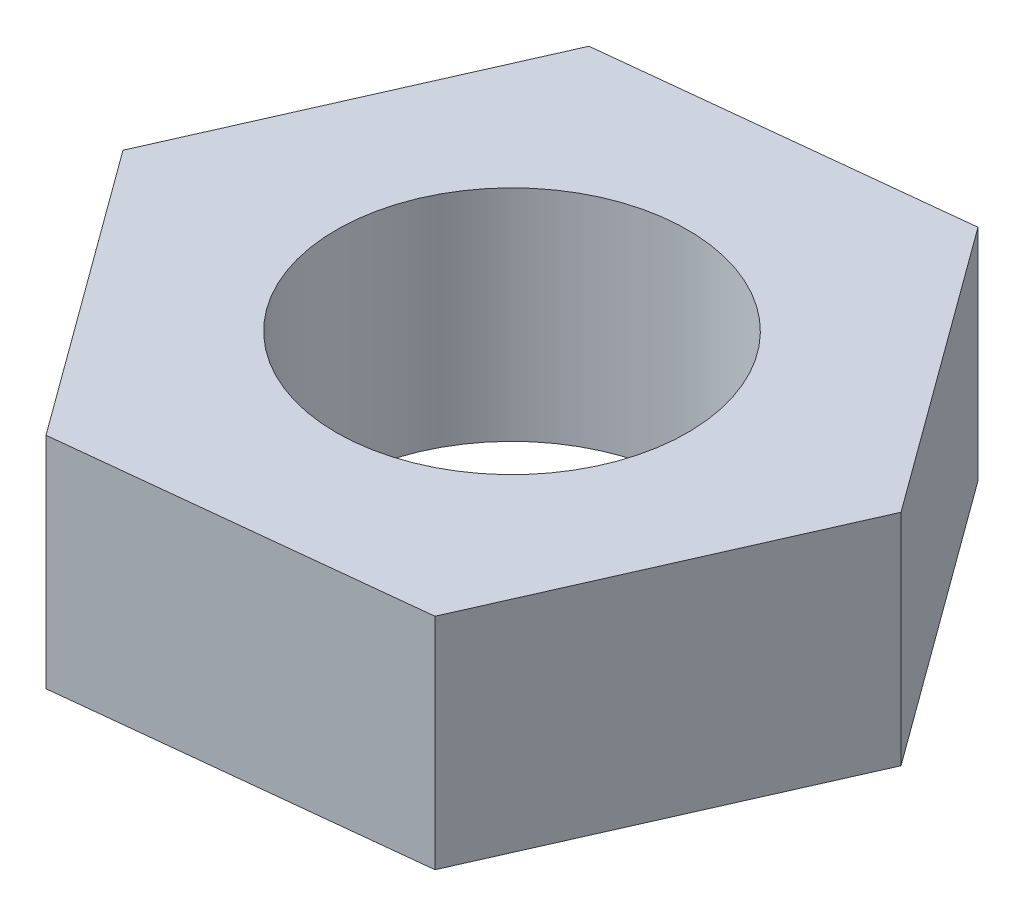
ISO-10303-21;
HEADER;
FILE_DESCRIPTION(('STEP AP214'),'2;1');
FILE_NAME('part.step','',(''),(''),'','','');
FILE_SCHEMA(('AUTOMOTIVE_DESIGN { 1 0 10303 214 1 1 1 1 }'));
ENDSEC;
DATA;
#1=APPLICATION_CONTEXT('core data for automotive mechanical design processes');
#2=APPLICATION_PROTOCOL_DEFINITION('international standard','automotive_design',2000,#1);
#3=PRODUCT_CONTEXT('',#1,'mechanical');
#4=PRODUCT('Part','Part','',(#3));
#5=PRODUCT_RELATED_PRODUCT_CATEGORY('part','',(#4));
#6=PRODUCT_DEFINITION_FORMATION('','',#4);
#7=PRODUCT_DEFINITION_CONTEXT('part definition',#1,'design');
#8=PRODUCT_DEFINITION('design','',#6,#7);
#9=PRODUCT_DEFINITION_SHAPE('','',#8);
#10=(LENGTH_UNIT() NAMED_UNIT(*) SI_UNIT(.MILLI.,.METRE.));
#11=(NAMED_UNIT(*) PLANE_ANGLE_UNIT() SI_UNIT($,.RADIAN.));
#12=(NAMED_UNIT(*) SI_UNIT($,.STERADIAN.) SOLID_ANGLE_UNIT());
#13=UNCERTAINTY_MEASURE_WITH_UNIT(LENGTH_MEASURE(1.E-05),#10,'distance_accuracy_value','');
#14=(GEOMETRIC_REPRESENTATION_CONTEXT(3) GLOBAL_UNCERTAINTY_ASSIGNED_CONTEXT((#13)) GLOBAL_UNIT_ASSIGNED_CONTEXT((#10,
#11,#12)) REPRESENTATION_CONTEXT('',''));
#15=CARTESIAN_POINT('',(0.,0.,0.));
#16=DIRECTION('',(0.,0.,1.));
#17=DIRECTION('',(1.,0.,0.));
#18=AXIS2_PLACEMENT_3D('',#15,#16,#17);
#19=CARTESIAN_POINT('',(0.,5.,0.));
#20=DIRECTION('',(0.,1.,0.));
#21=DIRECTION('',(0.,0.,1.));
#22=AXIS2_PLACEMENT_3D('',#19,#20,#21);
#23=PLANE('',#22);
#24=DIRECTION('',(0.99427058744468,0.,-0.106892464385528));
#25=VECTOR('',#24,1.);
#26=CARTESIAN_POINT('',(-3.25487879021415,5.,7.35760174160312));
#27=LINE('',#26,#25);
#28=CARTESIAN_POINT('',(-3.25487879021415,5.,7.35760174160312));
#29=VERTEX_POINT('',#28);
#30=CARTESIAN_POINT('',(4.74443062404986,5.,6.49760858936617));
#31=VERTEX_POINT('',#30);
#32=EDGE_CURVE('E150',#29,#31,#27,.T.);
#33=ORIENTED_EDGE('',*,*,#32,.T.);
#34=DIRECTION('',(0.404563704091349,0.,-0.914509819155534));
#35=VECTOR('',#34,1.);
#36=CARTESIAN_POINT('',(4.74443062404986,5.,6.49760858936617));
#37=LINE('',#36,#35);
#38=CARTESIAN_POINT('',(7.999309414264,5.,-0.859993152236947));
#39=VERTEX_POINT('',#38);
#40=EDGE_CURVE('E98',#31,#39,#37,.T.);
#41=ORIENTED_EDGE('',*,*,#40,.T.);
#42=DIRECTION('',(-0.58970688335333,0.,-0.807617354770006));
#43=VECTOR('',#42,1.);
#44=CARTESIAN_POINT('',(7.999309414264,5.,-0.859993152236947));
#45=LINE('',#44,#43);
#46=CARTESIAN_POINT('',(3.25487879021415,5.,-7.35760174160312));
#47=VERTEX_POINT('',#46);
#48=EDGE_CURVE('E111',#39,#47,#45,.T.);
#49=ORIENTED_EDGE('',*,*,#48,.T.);
#50=DIRECTION('',(-0.99427058744468,0.,0.106892464385527));
#51=VECTOR('',#50,1.);
#52=CARTESIAN_POINT('',(3.25487879021415,5.,-7.35760174160312));
#53=LINE('',#52,#51);
#54=CARTESIAN_POINT('',(-4.74443062404986,5.,-6.49760858936618));
#55=VERTEX_POINT('',#54);
#56=EDGE_CURVE('E105',#47,#55,#53,.T.);
#57=ORIENTED_EDGE('',*,*,#56,.T.);
#58=DIRECTION('',(-0.404563704091349,0.,0.914509819155534));
#59=VECTOR('',#58,1.);
#60=CARTESIAN_POINT('',(-4.74443062404986,5.,-6.49760858936618));
#61=LINE('',#60,#59);
#62=CARTESIAN_POINT('',(-7.999309414264,5.,0.859993152236946));
#63=VERTEX_POINT('',#62);
#64=EDGE_CURVE('E109',#55,#63,#61,.T.);
#65=ORIENTED_EDGE('',*,*,#64,.T.);
#66=DIRECTION('',(0.58970688335333,0.,0.807617354770006));
#67=VECTOR('',#66,1.);
#68=CARTESIAN_POINT('',(-7.999309414264,5.,0.859993152236946));
#69=LINE('',#68,#67);
#70=EDGE_CURVE('E61',#63,#29,#69,.T.);
#71=ORIENTED_EDGE('',*,*,#70,.T.);
#72=EDGE_LOOP('',(#33,#41,#49,#57,#65,#71));
#73=FACE_BOUND('',#72,.T.);
#74=CARTESIAN_POINT('',(0.,5.,0.));
#75=DIRECTION('',(0.,1.,0.));
#76=DIRECTION('',(0.,0.,1.));
#77=AXIS2_PLACEMENT_3D('',#74,#75,#76);
#78=CIRCLE('',#77,4.);
#79=CARTESIAN_POINT('',(0.,5.,4.));
#80=VERTEX_POINT('',#79);
#81=EDGE_CURVE('E138',#80,#80,#78,.T.);
#82=ORIENTED_EDGE('',*,*,#81,.F.);
#83=EDGE_LOOP('',(#82));
#84=FACE_BOUND('',#83,.T.);
#85=ADVANCED_FACE('F43',(#73,#84),#23,.T.);
#86=CARTESIAN_POINT('',(0.,0.,0.));
#87=DIRECTION('',(0.,1.,0.));
#88=DIRECTION('',(0.,0.,1.));
#89=AXIS2_PLACEMENT_3D('',#86,#87,#88);
#90=PLANE('',#89);
#91=DIRECTION('',(0.99427058744468,0.,-0.106892464385528));
#92=VECTOR('',#91,1.);
#93=CARTESIAN_POINT('',(-3.25487879021415,0.,7.35760174160312));
#94=LINE('',#93,#92);
#95=CARTESIAN_POINT('',(-3.25487879021415,0.,7.35760174160312));
#96=VERTEX_POINT('',#95);
#97=CARTESIAN_POINT('',(4.74443062404986,0.,6.49760858936617));
#98=VERTEX_POINT('',#97);
#99=EDGE_CURVE('E133',#96,#98,#94,.T.);
#100=ORIENTED_EDGE('',*,*,#99,.F.);
#101=DIRECTION('',(0.58970688335333,0.,0.807617354770006));
#102=VECTOR('',#101,1.);
#103=CARTESIAN_POINT('',(-7.999309414264,0.,0.859993152236946));
#104=LINE('',#103,#102);
#105=CARTESIAN_POINT('',(-7.999309414264,0.,0.859993152236946));
#106=VERTEX_POINT('',#105);
#107=EDGE_CURVE('E90',#106,#96,#104,.T.);
#108=ORIENTED_EDGE('',*,*,#107,.F.);
#109=DIRECTION('',(-0.404563704091349,0.,0.914509819155534));
#110=VECTOR('',#109,1.);
#111=CARTESIAN_POINT('',(-4.74443062404986,0.,-6.49760858936618));
#112=LINE('',#111,#110);
#113=CARTESIAN_POINT('',(-4.74443062404986,0.,-6.49760858936618));
#114=VERTEX_POINT('',#113);
#115=EDGE_CURVE('E84',#114,#106,#112,.T.);
#116=ORIENTED_EDGE('',*,*,#115,.F.);
#117=DIRECTION('',(-0.99427058744468,0.,0.106892464385527));
#118=VECTOR('',#117,1.);
#119=CARTESIAN_POINT('',(3.25487879021415,0.,-7.35760174160312));
#120=LINE('',#119,#118);
#121=CARTESIAN_POINT('',(3.25487879021415,0.,-7.35760174160312));
#122=VERTEX_POINT('',#121);
#123=EDGE_CURVE('E120',#122,#114,#120,.T.);
#124=ORIENTED_EDGE('',*,*,#123,.F.);
#125=DIRECTION('',(-0.58970688335333,0.,-0.807617354770006));
#126=VECTOR('',#125,1.);
#127=CARTESIAN_POINT('',(7.999309414264,0.,-0.859993152236947));
#128=LINE('',#127,#126);
#129=CARTESIAN_POINT('',(7.999309414264,0.,-0.859993152236947));
#130=VERTEX_POINT('',#129);
#131=EDGE_CURVE('E141',#130,#122,#128,.T.);
#132=ORIENTED_EDGE('',*,*,#131,.F.);
#133=DIRECTION('',(0.404563704091349,0.,-0.914509819155534));
#134=VECTOR('',#133,1.);
#135=CARTESIAN_POINT('',(4.74443062404986,0.,6.49760858936617));
#136=LINE('',#135,#134);
#137=EDGE_CURVE('E137',#98,#130,#136,.T.);
#138=ORIENTED_EDGE('',*,*,#137,.F.);
#139=EDGE_LOOP('',(#100,#108,#116,#124,#132,#138));
#140=FACE_BOUND('',#139,.T.);
#141=CARTESIAN_POINT('',(0.,0.,0.));
#142=DIRECTION('',(0.,1.,0.));
#143=DIRECTION('',(0.,0.,1.));
#144=AXIS2_PLACEMENT_3D('',#141,#142,#143);
#145=CIRCLE('',#144,4.);
#146=CARTESIAN_POINT('',(0.,0.,4.));
#147=VERTEX_POINT('',#146);
#148=EDGE_CURVE('E265',#147,#147,#145,.T.);
#149=ORIENTED_EDGE('',*,*,#148,.T.);
#150=EDGE_LOOP('',(#149));
#151=FACE_BOUND('',#150,.T.);
#152=ADVANCED_FACE('F163',(#140,#151),#90,.F.);
#153=CARTESIAN_POINT('',(-3.25487879021415,5.,7.35760174160312));
#154=DIRECTION('',(-0.106892464385528,0.,-0.99427058744468));
#155=DIRECTION('',(-0.99427058744468,0.,0.106892464385528));
#156=AXIS2_PLACEMENT_3D('',#153,#154,#155);
#157=PLANE('',#156);
#158=ORIENTED_EDGE('',*,*,#99,.T.);
#159=DIRECTION('',(0.,-1.,0.));
#160=VECTOR('',#159,1.);
#161=CARTESIAN_POINT('',(4.74443062404986,5.,6.49760858936617));
#162=LINE('',#161,#160);
#163=EDGE_CURVE('E11',#31,#98,#162,.T.);
#164=ORIENTED_EDGE('',*,*,#163,.F.);
#165=ORIENTED_EDGE('',*,*,#32,.F.);
#166=DIRECTION('',(0.,-1.,0.));
#167=VECTOR('',#166,1.);
#168=CARTESIAN_POINT('',(-3.25487879021415,5.,7.35760174160312));
#169=LINE('',#168,#167);
#170=EDGE_CURVE('E129',#29,#96,#169,.T.);
#171=ORIENTED_EDGE('',*,*,#170,.T.);
#172=EDGE_LOOP('',(#158,#164,#165,#171));
#173=FACE_BOUND('',#172,.T.);
#174=ADVANCED_FACE('F45',(#173),#157,.F.);
#175=CARTESIAN_POINT('',(4.74443062404986,5.,6.49760858936617));
#176=DIRECTION('',(-0.914509819155534,0.,-0.404563704091349));
#177=DIRECTION('',(-0.40456370409135,0.,0.914509819155534));
#178=AXIS2_PLACEMENT_3D('',#175,#176,#177);
#179=PLANE('',#178);
#180=ORIENTED_EDGE('',*,*,#137,.T.);
#181=DIRECTION('',(0.,-1.,0.));
#182=VECTOR('',#181,1.);
#183=CARTESIAN_POINT('',(7.999309414264,5.,-0.859993152236947));
#184=LINE('',#183,#182);
#185=EDGE_CURVE('E53',#39,#130,#184,.T.);
#186=ORIENTED_EDGE('',*,*,#185,.F.);
#187=ORIENTED_EDGE('',*,*,#40,.F.);
#188=ORIENTED_EDGE('',*,*,#163,.T.);
#189=EDGE_LOOP('',(#180,#186,#187,#188));
#190=FACE_BOUND('',#189,.T.);
#191=ADVANCED_FACE('F188',(#190),#179,.F.);
#192=CARTESIAN_POINT('',(7.999309414264,5.,-0.859993152236947));
#193=DIRECTION('',(-0.807617354770006,0.,0.58970688335333));
#194=DIRECTION('',(0.58970688335333,0.,0.807617354770006));
#195=AXIS2_PLACEMENT_3D('',#192,#193,#194);
#196=PLANE('',#195);
#197=ORIENTED_EDGE('',*,*,#131,.T.);
#198=DIRECTION('',(0.,-1.,0.));
#199=VECTOR('',#198,1.);
#200=CARTESIAN_POINT('',(3.25487879021415,5.,-7.35760174160312));
#201=LINE('',#200,#199);
#202=EDGE_CURVE('E122',#47,#122,#201,.T.);
#203=ORIENTED_EDGE('',*,*,#202,.F.);
#204=ORIENTED_EDGE('',*,*,#48,.F.);
#205=ORIENTED_EDGE('',*,*,#185,.T.);
#206=EDGE_LOOP('',(#197,#203,#204,#205));
#207=FACE_BOUND('',#206,.T.);
#208=ADVANCED_FACE('F160',(#207),#196,.F.);
#209=CARTESIAN_POINT('',(3.25487879021415,5.,-7.35760174160312));
#210=DIRECTION('',(0.106892464385527,0.,0.99427058744468));
#211=DIRECTION('',(0.99427058744468,0.,-0.106892464385527));
#212=AXIS2_PLACEMENT_3D('',#209,#210,#211);
#213=PLANE('',#212);
#214=ORIENTED_EDGE('',*,*,#123,.T.);
#215=DIRECTION('',(0.,-1.,0.));
#216=VECTOR('',#215,1.);
#217=CARTESIAN_POINT('',(-4.74443062404986,5.,-6.49760858936618));
#218=LINE('',#217,#216);
#219=EDGE_CURVE('E117',#55,#114,#218,.T.);
#220=ORIENTED_EDGE('',*,*,#219,.F.);
#221=ORIENTED_EDGE('',*,*,#56,.F.);
#222=ORIENTED_EDGE('',*,*,#202,.T.);
#223=EDGE_LOOP('',(#214,#220,#221,#222));
#224=FACE_BOUND('',#223,.T.);
#225=ADVANCED_FACE('F118',(#224),#213,.F.);
#226=CARTESIAN_POINT('',(-4.74443062404986,5.,-6.49760858936618));
#227=DIRECTION('',(0.914509819155534,0.,0.404563704091349));
#228=DIRECTION('',(0.404563704091349,0.,-0.914509819155534));
#229=AXIS2_PLACEMENT_3D('',#226,#227,#228);
#230=PLANE('',#229);
#231=ORIENTED_EDGE('',*,*,#115,.T.);
#232=DIRECTION('',(0.,-1.,0.));
#233=VECTOR('',#232,1.);
#234=CARTESIAN_POINT('',(-7.999309414264,5.,0.859993152236946));
#235=LINE('',#234,#233);
#236=EDGE_CURVE('E123',#63,#106,#235,.T.);
#237=ORIENTED_EDGE('',*,*,#236,.F.);
#238=ORIENTED_EDGE('',*,*,#64,.F.);
#239=ORIENTED_EDGE('',*,*,#219,.T.);
#240=EDGE_LOOP('',(#231,#237,#238,#239));
#241=FACE_BOUND('',#240,.T.);
#242=ADVANCED_FACE('F125',(#241),#230,.F.);
#243=CARTESIAN_POINT('',(-7.999309414264,5.,0.859993152236946));
#244=DIRECTION('',(0.807617354770007,0.,-0.58970688335333));
#245=DIRECTION('',(-0.58970688335333,0.,-0.807617354770007));
#246=AXIS2_PLACEMENT_3D('',#243,#244,#245);
#247=PLANE('',#246);
#248=ORIENTED_EDGE('',*,*,#107,.T.);
#249=ORIENTED_EDGE('',*,*,#170,.F.);
#250=ORIENTED_EDGE('',*,*,#70,.F.);
#251=ORIENTED_EDGE('',*,*,#236,.T.);
#252=EDGE_LOOP('',(#248,#249,#250,#251));
#253=FACE_BOUND('',#252,.T.);
#254=ADVANCED_FACE('F168',(#253),#247,.F.);
#255=CARTESIAN_POINT('',(0.,5.,0.));
#256=DIRECTION('',(0.,-1.,0.));
#257=DIRECTION('',(0.,0.,-1.));
#258=AXIS2_PLACEMENT_3D('',#255,#256,#257);
#259=CYLINDRICAL_SURFACE('',#258,4.);
#260=ORIENTED_EDGE('',*,*,#81,.T.);
#261=EDGE_LOOP('',(#260));
#262=FACE_BOUND('',#261,.T.);
#263=ORIENTED_EDGE('',*,*,#148,.F.);
#264=EDGE_LOOP('',(#263));
#265=FACE_BOUND('',#264,.T.);
#266=ADVANCED_FACE('F170',(#262,#265),#259,.F.);
#267=CLOSED_SHELL('',(#85,#152,#174,#191,#208,#225,#242,#254,#266));
#268=MANIFOLD_SOLID_BREP('B2',#267);
#269=ADVANCED_BREP_SHAPE_REPRESENTATION('',(#18,#268),#14);
#270=SHAPE_DEFINITION_REPRESENTATION(#9,#269);
ENDSEC;
END-ISO-10303-21;
